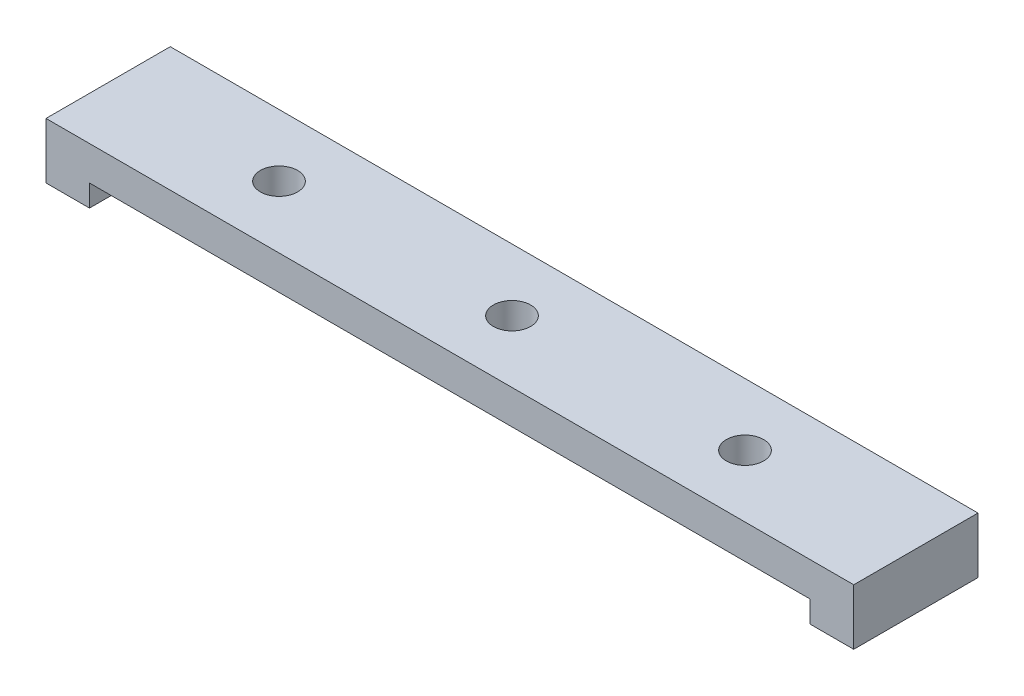
ISO-10303-21;
HEADER;
FILE_DESCRIPTION(('STEP AP214'),'2;1');
FILE_NAME('part.step','',(''),(''),'','','');
FILE_SCHEMA(('AUTOMOTIVE_DESIGN { 1 0 10303 214 1 1 1 1 }'));
ENDSEC;
DATA;
#1=APPLICATION_CONTEXT('core data for automotive mechanical design processes');
#2=APPLICATION_PROTOCOL_DEFINITION('international standard','automotive_design',2000,#1);
#3=PRODUCT_CONTEXT('',#1,'mechanical');
#4=PRODUCT('Part','Part','',(#3));
#5=PRODUCT_RELATED_PRODUCT_CATEGORY('part','',(#4));
#6=PRODUCT_DEFINITION_FORMATION('','',#4);
#7=PRODUCT_DEFINITION_CONTEXT('part definition',#1,'design');
#8=PRODUCT_DEFINITION('design','',#6,#7);
#9=PRODUCT_DEFINITION_SHAPE('','',#8);
#10=(LENGTH_UNIT() NAMED_UNIT(*) SI_UNIT(.MILLI.,.METRE.));
#11=(NAMED_UNIT(*) PLANE_ANGLE_UNIT() SI_UNIT($,.RADIAN.));
#12=(NAMED_UNIT(*) SI_UNIT($,.STERADIAN.) SOLID_ANGLE_UNIT());
#13=UNCERTAINTY_MEASURE_WITH_UNIT(LENGTH_MEASURE(1.E-05),#10,'distance_accuracy_value','');
#14=(GEOMETRIC_REPRESENTATION_CONTEXT(3) GLOBAL_UNCERTAINTY_ASSIGNED_CONTEXT((#13)) GLOBAL_UNIT_ASSIGNED_CONTEXT((#10,
#11,#12)) REPRESENTATION_CONTEXT('',''));
#15=CARTESIAN_POINT('',(0.,0.,0.));
#16=DIRECTION('',(0.,0.,1.));
#17=DIRECTION('',(1.,0.,0.));
#18=AXIS2_PLACEMENT_3D('',#15,#16,#17);
#19=CARTESIAN_POINT('',(0.,0.,0.));
#20=DIRECTION('',(0.,-1.,0.));
#21=DIRECTION('',(0.,0.,-1.));
#22=AXIS2_PLACEMENT_3D('',#19,#20,#21);
#23=PLANE('',#22);
#24=DIRECTION('',(0.,0.,-1.));
#25=VECTOR('',#24,1.);
#26=CARTESIAN_POINT('',(3.5,0.,0.));
#27=LINE('',#26,#25);
#28=CARTESIAN_POINT('',(3.5,0.,0.));
#29=VERTEX_POINT('',#28);
#30=CARTESIAN_POINT('',(3.5,0.,-10.));
#31=VERTEX_POINT('',#30);
#32=EDGE_CURVE('E109',#29,#31,#27,.T.);
#33=ORIENTED_EDGE('',*,*,#32,.F.);
#34=DIRECTION('',(1.,0.,0.));
#35=VECTOR('',#34,1.);
#36=CARTESIAN_POINT('',(0.,0.,0.));
#37=LINE('',#36,#35);
#38=CARTESIAN_POINT('',(0.,0.,0.));
#39=VERTEX_POINT('',#38);
#40=EDGE_CURVE('E132',#39,#29,#37,.T.);
#41=ORIENTED_EDGE('',*,*,#40,.F.);
#42=DIRECTION('',(0.,0.,1.));
#43=VECTOR('',#42,1.);
#44=CARTESIAN_POINT('',(0.,0.,0.));
#45=LINE('',#44,#43);
#46=CARTESIAN_POINT('',(0.,0.,-10.));
#47=VERTEX_POINT('',#46);
#48=EDGE_CURVE('E126',#47,#39,#45,.T.);
#49=ORIENTED_EDGE('',*,*,#48,.F.);
#50=DIRECTION('',(-1.,0.,0.));
#51=VECTOR('',#50,1.);
#52=CARTESIAN_POINT('',(0.,0.,-10.));
#53=LINE('',#52,#51);
#54=EDGE_CURVE('E82',#31,#47,#53,.T.);
#55=ORIENTED_EDGE('',*,*,#54,.F.);
#56=EDGE_LOOP('',(#33,#41,#49,#55));
#57=FACE_BOUND('',#56,.T.);
#58=ADVANCED_FACE('F37',(#57),#23,.T.);
#59=CARTESIAN_POINT('',(13.75,4.5,-5.));
#60=DIRECTION('',(0.,-1.,0.));
#61=DIRECTION('',(0.,0.,-1.));
#62=AXIS2_PLACEMENT_3D('',#59,#60,#61);
#63=CYLINDRICAL_SURFACE('',#62,1.5);
#64=CARTESIAN_POINT('',(13.75,4.5,-5.));
#65=DIRECTION('',(0.,1.,0.));
#66=DIRECTION('',(0.,0.,1.));
#67=AXIS2_PLACEMENT_3D('',#64,#65,#66);
#68=CIRCLE('',#67,1.5);
#69=CARTESIAN_POINT('',(13.75,4.5,-3.5));
#70=VERTEX_POINT('',#69);
#71=EDGE_CURVE('E159',#70,#70,#68,.T.);
#72=ORIENTED_EDGE('',*,*,#71,.T.);
#73=EDGE_LOOP('',(#72));
#74=FACE_BOUND('',#73,.T.);
#75=CARTESIAN_POINT('',(13.75,1.75,-5.));
#76=DIRECTION('',(0.,-1.,0.));
#77=DIRECTION('',(0.,0.,-1.));
#78=AXIS2_PLACEMENT_3D('',#75,#76,#77);
#79=CIRCLE('',#78,1.5);
#80=CARTESIAN_POINT('',(13.75,1.75,-6.5));
#81=VERTEX_POINT('',#80);
#82=EDGE_CURVE('E179',#81,#81,#79,.T.);
#83=ORIENTED_EDGE('',*,*,#82,.T.);
#84=EDGE_LOOP('',(#83));
#85=FACE_BOUND('',#84,.T.);
#86=ADVANCED_FACE('F201',(#74,#85),#63,.F.);
#87=CARTESIAN_POINT('',(32.5,4.5,-5.));
#88=DIRECTION('',(0.,-1.,0.));
#89=DIRECTION('',(0.,0.,-1.));
#90=AXIS2_PLACEMENT_3D('',#87,#88,#89);
#91=CYLINDRICAL_SURFACE('',#90,1.5);
#92=CARTESIAN_POINT('',(32.5,4.5,-5.));
#93=DIRECTION('',(0.,1.,0.));
#94=DIRECTION('',(0.,0.,1.));
#95=AXIS2_PLACEMENT_3D('',#92,#93,#94);
#96=CIRCLE('',#95,1.5);
#97=CARTESIAN_POINT('',(32.5,4.5,-3.5));
#98=VERTEX_POINT('',#97);
#99=EDGE_CURVE('E185',#98,#98,#96,.T.);
#100=ORIENTED_EDGE('',*,*,#99,.T.);
#101=EDGE_LOOP('',(#100));
#102=FACE_BOUND('',#101,.T.);
#103=CARTESIAN_POINT('',(32.5,1.75,-5.));
#104=DIRECTION('',(0.,-1.,0.));
#105=DIRECTION('',(0.,0.,-1.));
#106=AXIS2_PLACEMENT_3D('',#103,#104,#105);
#107=CIRCLE('',#106,1.5);
#108=CARTESIAN_POINT('',(32.5,1.75,-6.50000000000001));
#109=VERTEX_POINT('',#108);
#110=EDGE_CURVE('E176',#109,#109,#107,.T.);
#111=ORIENTED_EDGE('',*,*,#110,.T.);
#112=EDGE_LOOP('',(#111));
#113=FACE_BOUND('',#112,.T.);
#114=ADVANCED_FACE('F205',(#102,#113),#91,.F.);
#115=CARTESIAN_POINT('',(51.25,4.5,-5.));
#116=DIRECTION('',(0.,-1.,0.));
#117=DIRECTION('',(0.,0.,-1.));
#118=AXIS2_PLACEMENT_3D('',#115,#116,#117);
#119=CYLINDRICAL_SURFACE('',#118,1.5);
#120=CARTESIAN_POINT('',(51.25,4.5,-5.));
#121=DIRECTION('',(0.,1.,0.));
#122=DIRECTION('',(0.,0.,1.));
#123=AXIS2_PLACEMENT_3D('',#120,#121,#122);
#124=CIRCLE('',#123,1.5);
#125=CARTESIAN_POINT('',(51.25,4.5,-3.5));
#126=VERTEX_POINT('',#125);
#127=EDGE_CURVE('E182',#126,#126,#124,.T.);
#128=ORIENTED_EDGE('',*,*,#127,.T.);
#129=EDGE_LOOP('',(#128));
#130=FACE_BOUND('',#129,.T.);
#131=CARTESIAN_POINT('',(51.25,1.75,-5.));
#132=DIRECTION('',(0.,-1.,0.));
#133=DIRECTION('',(0.,0.,-1.));
#134=AXIS2_PLACEMENT_3D('',#131,#132,#133);
#135=CIRCLE('',#134,1.5);
#136=CARTESIAN_POINT('',(51.25,1.75,-6.50000000000001));
#137=VERTEX_POINT('',#136);
#138=EDGE_CURVE('E41',#137,#137,#135,.T.);
#139=ORIENTED_EDGE('',*,*,#138,.T.);
#140=EDGE_LOOP('',(#139));
#141=FACE_BOUND('',#140,.T.);
#142=ADVANCED_FACE('F265',(#130,#141),#119,.F.);
#143=CARTESIAN_POINT('',(0.,4.5,0.));
#144=DIRECTION('',(0.,-1.,0.));
#145=DIRECTION('',(0.,0.,-1.));
#146=AXIS2_PLACEMENT_3D('',#143,#144,#145);
#147=PLANE('',#146);
#148=ORIENTED_EDGE('',*,*,#99,.F.);
#149=EDGE_LOOP('',(#148));
#150=FACE_BOUND('',#149,.T.);
#151=DIRECTION('',(0.,0.,1.));
#152=VECTOR('',#151,1.);
#153=CARTESIAN_POINT('',(0.,4.5,0.));
#154=LINE('',#153,#152);
#155=CARTESIAN_POINT('',(0.,4.5,-10.));
#156=VERTEX_POINT('',#155);
#157=CARTESIAN_POINT('',(0.,4.5,0.));
#158=VERTEX_POINT('',#157);
#159=EDGE_CURVE('E131',#156,#158,#154,.T.);
#160=ORIENTED_EDGE('',*,*,#159,.T.);
#161=DIRECTION('',(1.,0.,0.));
#162=VECTOR('',#161,1.);
#163=CARTESIAN_POINT('',(0.,4.5,0.));
#164=LINE('',#163,#162);
#165=CARTESIAN_POINT('',(65.,4.5,0.));
#166=VERTEX_POINT('',#165);
#167=EDGE_CURVE('E89',#158,#166,#164,.T.);
#168=ORIENTED_EDGE('',*,*,#167,.T.);
#169=DIRECTION('',(0.,0.,-1.));
#170=VECTOR('',#169,1.);
#171=CARTESIAN_POINT('',(65.,4.5,0.));
#172=LINE('',#171,#170);
#173=CARTESIAN_POINT('',(65.,4.5,-10.));
#174=VERTEX_POINT('',#173);
#175=EDGE_CURVE('E147',#166,#174,#172,.T.);
#176=ORIENTED_EDGE('',*,*,#175,.T.);
#177=DIRECTION('',(-1.,0.,0.));
#178=VECTOR('',#177,1.);
#179=CARTESIAN_POINT('',(0.,4.5,-10.));
#180=LINE('',#179,#178);
#181=EDGE_CURVE('E62',#174,#156,#180,.T.);
#182=ORIENTED_EDGE('',*,*,#181,.T.);
#183=EDGE_LOOP('',(#160,#168,#176,#182));
#184=FACE_BOUND('',#183,.T.);
#185=ORIENTED_EDGE('',*,*,#71,.F.);
#186=EDGE_LOOP('',(#185));
#187=FACE_BOUND('',#186,.T.);
#188=ORIENTED_EDGE('',*,*,#127,.F.);
#189=EDGE_LOOP('',(#188));
#190=FACE_BOUND('',#189,.T.);
#191=ADVANCED_FACE('F190',(#150,#184,#187,#190),#147,.F.);
#192=DIRECTION('',(0.,0.,1.));
#193=VECTOR('',#192,1.);
#194=CARTESIAN_POINT('',(61.5,0.,0.));
#195=LINE('',#194,#193);
#196=CARTESIAN_POINT('',(61.5,0.,-10.));
#197=VERTEX_POINT('',#196);
#198=CARTESIAN_POINT('',(61.5,0.,0.));
#199=VERTEX_POINT('',#198);
#200=EDGE_CURVE('E115',#197,#199,#195,.T.);
#201=ORIENTED_EDGE('',*,*,#200,.F.);
#202=CARTESIAN_POINT('',(65.,0.,-10.));
#203=VERTEX_POINT('',#202);
#204=EDGE_CURVE('E127',#203,#197,#53,.T.);
#205=ORIENTED_EDGE('',*,*,#204,.F.);
#206=DIRECTION('',(0.,0.,-1.));
#207=VECTOR('',#206,1.);
#208=CARTESIAN_POINT('',(65.,0.,0.));
#209=LINE('',#208,#207);
#210=CARTESIAN_POINT('',(65.,0.,0.));
#211=VERTEX_POINT('',#210);
#212=EDGE_CURVE('E128',#211,#203,#209,.T.);
#213=ORIENTED_EDGE('',*,*,#212,.F.);
#214=EDGE_CURVE('E153',#199,#211,#37,.T.);
#215=ORIENTED_EDGE('',*,*,#214,.F.);
#216=EDGE_LOOP('',(#201,#205,#213,#215));
#217=FACE_BOUND('',#216,.T.);
#218=ADVANCED_FACE('F152',(#217),#23,.T.);
#219=CARTESIAN_POINT('',(0.,4.5,0.));
#220=DIRECTION('',(1.,0.,0.));
#221=DIRECTION('',(0.,0.,-1.));
#222=AXIS2_PLACEMENT_3D('',#219,#220,#221);
#223=PLANE('',#222);
#224=ORIENTED_EDGE('',*,*,#48,.T.);
#225=DIRECTION('',(0.,-1.,0.));
#226=VECTOR('',#225,1.);
#227=CARTESIAN_POINT('',(0.,4.5,0.));
#228=LINE('',#227,#226);
#229=EDGE_CURVE('E12',#158,#39,#228,.T.);
#230=ORIENTED_EDGE('',*,*,#229,.F.);
#231=ORIENTED_EDGE('',*,*,#159,.F.);
#232=DIRECTION('',(0.,-1.,0.));
#233=VECTOR('',#232,1.);
#234=CARTESIAN_POINT('',(0.,4.5,-10.));
#235=LINE('',#234,#233);
#236=EDGE_CURVE('E136',#156,#47,#235,.T.);
#237=ORIENTED_EDGE('',*,*,#236,.T.);
#238=EDGE_LOOP('',(#224,#230,#231,#237));
#239=FACE_BOUND('',#238,.T.);
#240=ADVANCED_FACE('F39',(#239),#223,.F.);
#241=CARTESIAN_POINT('',(0.,4.5,0.));
#242=DIRECTION('',(0.,0.,-1.));
#243=DIRECTION('',(-1.,0.,0.));
#244=AXIS2_PLACEMENT_3D('',#241,#242,#243);
#245=PLANE('',#244);
#246=ORIENTED_EDGE('',*,*,#40,.T.);
#247=DIRECTION('',(0.,-1.,0.));
#248=VECTOR('',#247,1.);
#249=CARTESIAN_POINT('',(3.5,63.3557558782486,0.));
#250=LINE('',#249,#248);
#251=CARTESIAN_POINT('',(3.5,1.75,0.));
#252=VERTEX_POINT('',#251);
#253=EDGE_CURVE('E112',#252,#29,#250,.T.);
#254=ORIENTED_EDGE('',*,*,#253,.F.);
#255=DIRECTION('',(1.,0.,0.));
#256=VECTOR('',#255,1.);
#257=CARTESIAN_POINT('',(3.5,1.75,0.));
#258=LINE('',#257,#256);
#259=CARTESIAN_POINT('',(61.5,1.75,0.));
#260=VERTEX_POINT('',#259);
#261=EDGE_CURVE('E166',#252,#260,#258,.T.);
#262=ORIENTED_EDGE('',*,*,#261,.T.);
#263=DIRECTION('',(0.,-1.,0.));
#264=VECTOR('',#263,1.);
#265=CARTESIAN_POINT('',(61.5,63.3557558782486,0.));
#266=LINE('',#265,#264);
#267=EDGE_CURVE('E164',#260,#199,#266,.T.);
#268=ORIENTED_EDGE('',*,*,#267,.T.);
#269=ORIENTED_EDGE('',*,*,#214,.T.);
#270=DIRECTION('',(0.,-1.,0.));
#271=VECTOR('',#270,1.);
#272=CARTESIAN_POINT('',(65.,4.5,0.));
#273=LINE('',#272,#271);
#274=EDGE_CURVE('E46',#166,#211,#273,.T.);
#275=ORIENTED_EDGE('',*,*,#274,.F.);
#276=ORIENTED_EDGE('',*,*,#167,.F.);
#277=ORIENTED_EDGE('',*,*,#229,.T.);
#278=EDGE_LOOP('',(#246,#254,#262,#268,#269,#275,#276,#277));
#279=FACE_BOUND('',#278,.T.);
#280=ADVANCED_FACE('F161',(#279),#245,.F.);
#281=CARTESIAN_POINT('',(65.,4.5,0.));
#282=DIRECTION('',(-1.,0.,0.));
#283=DIRECTION('',(0.,0.,1.));
#284=AXIS2_PLACEMENT_3D('',#281,#282,#283);
#285=PLANE('',#284);
#286=ORIENTED_EDGE('',*,*,#212,.T.);
#287=DIRECTION('',(0.,-1.,0.));
#288=VECTOR('',#287,1.);
#289=CARTESIAN_POINT('',(65.,4.5,-10.));
#290=LINE('',#289,#288);
#291=EDGE_CURVE('E138',#174,#203,#290,.T.);
#292=ORIENTED_EDGE('',*,*,#291,.F.);
#293=ORIENTED_EDGE('',*,*,#175,.F.);
#294=ORIENTED_EDGE('',*,*,#274,.T.);
#295=EDGE_LOOP('',(#286,#292,#293,#294));
#296=FACE_BOUND('',#295,.T.);
#297=ADVANCED_FACE('F145',(#296),#285,.F.);
#298=CARTESIAN_POINT('',(0.,4.5,-10.));
#299=DIRECTION('',(0.,0.,1.));
#300=DIRECTION('',(1.,0.,0.));
#301=AXIS2_PLACEMENT_3D('',#298,#299,#300);
#302=PLANE('',#301);
#303=DIRECTION('',(-1.,0.,0.));
#304=VECTOR('',#303,1.);
#305=CARTESIAN_POINT('',(3.5,1.75,-10.));
#306=LINE('',#305,#304);
#307=CARTESIAN_POINT('',(61.5,1.75,-10.));
#308=VERTEX_POINT('',#307);
#309=CARTESIAN_POINT('',(3.5,1.75,-10.));
#310=VERTEX_POINT('',#309);
#311=EDGE_CURVE('E121',#308,#310,#306,.T.);
#312=ORIENTED_EDGE('',*,*,#311,.T.);
#313=DIRECTION('',(0.,-1.,0.));
#314=VECTOR('',#313,1.);
#315=CARTESIAN_POINT('',(3.5,63.3557558782486,-10.));
#316=LINE('',#315,#314);
#317=EDGE_CURVE('E53',#310,#31,#316,.T.);
#318=ORIENTED_EDGE('',*,*,#317,.T.);
#319=ORIENTED_EDGE('',*,*,#54,.T.);
#320=ORIENTED_EDGE('',*,*,#236,.F.);
#321=ORIENTED_EDGE('',*,*,#181,.F.);
#322=ORIENTED_EDGE('',*,*,#291,.T.);
#323=ORIENTED_EDGE('',*,*,#204,.T.);
#324=DIRECTION('',(0.,-1.,0.));
#325=VECTOR('',#324,1.);
#326=CARTESIAN_POINT('',(61.5,63.3557558782486,-10.));
#327=LINE('',#326,#325);
#328=EDGE_CURVE('E122',#308,#197,#327,.T.);
#329=ORIENTED_EDGE('',*,*,#328,.F.);
#330=EDGE_LOOP('',(#312,#318,#319,#320,#321,#322,#323,#329));
#331=FACE_BOUND('',#330,.T.);
#332=ADVANCED_FACE('F118',(#331),#302,.F.);
#333=CARTESIAN_POINT('',(3.5,63.3557558782486,0.));
#334=DIRECTION('',(-1.,0.,0.));
#335=DIRECTION('',(0.,0.,1.));
#336=AXIS2_PLACEMENT_3D('',#333,#334,#335);
#337=PLANE('',#336);
#338=DIRECTION('',(0.,0.,1.));
#339=VECTOR('',#338,1.);
#340=CARTESIAN_POINT('',(3.5,1.75,0.));
#341=LINE('',#340,#339);
#342=EDGE_CURVE('E175',#310,#252,#341,.T.);
#343=ORIENTED_EDGE('',*,*,#342,.T.);
#344=ORIENTED_EDGE('',*,*,#253,.T.);
#345=ORIENTED_EDGE('',*,*,#32,.T.);
#346=ORIENTED_EDGE('',*,*,#317,.F.);
#347=EDGE_LOOP('',(#343,#344,#345,#346));
#348=FACE_BOUND('',#347,.T.);
#349=ADVANCED_FACE('F110',(#348),#337,.F.);
#350=CARTESIAN_POINT('',(61.5,63.3557558782486,0.));
#351=DIRECTION('',(1.,0.,0.));
#352=DIRECTION('',(0.,0.,-1.));
#353=AXIS2_PLACEMENT_3D('',#350,#351,#352);
#354=PLANE('',#353);
#355=DIRECTION('',(0.,0.,-1.));
#356=VECTOR('',#355,1.);
#357=CARTESIAN_POINT('',(61.5,1.75,0.));
#358=LINE('',#357,#356);
#359=EDGE_CURVE('E169',#260,#308,#358,.T.);
#360=ORIENTED_EDGE('',*,*,#359,.T.);
#361=ORIENTED_EDGE('',*,*,#328,.T.);
#362=ORIENTED_EDGE('',*,*,#200,.T.);
#363=ORIENTED_EDGE('',*,*,#267,.F.);
#364=EDGE_LOOP('',(#360,#361,#362,#363));
#365=FACE_BOUND('',#364,.T.);
#366=ADVANCED_FACE('F227',(#365),#354,.F.);
#367=CARTESIAN_POINT('',(0.,1.75,0.));
#368=DIRECTION('',(0.,-1.,0.));
#369=DIRECTION('',(0.,0.,-1.));
#370=AXIS2_PLACEMENT_3D('',#367,#368,#369);
#371=PLANE('',#370);
#372=ORIENTED_EDGE('',*,*,#82,.F.);
#373=EDGE_LOOP('',(#372));
#374=FACE_BOUND('',#373,.T.);
#375=ORIENTED_EDGE('',*,*,#110,.F.);
#376=EDGE_LOOP('',(#375));
#377=FACE_BOUND('',#376,.T.);
#378=ORIENTED_EDGE('',*,*,#138,.F.);
#379=EDGE_LOOP('',(#378));
#380=FACE_BOUND('',#379,.T.);
#381=ORIENTED_EDGE('',*,*,#342,.F.);
#382=ORIENTED_EDGE('',*,*,#311,.F.);
#383=ORIENTED_EDGE('',*,*,#359,.F.);
#384=ORIENTED_EDGE('',*,*,#261,.F.);
#385=EDGE_LOOP('',(#381,#382,#383,#384));
#386=FACE_BOUND('',#385,.T.);
#387=ADVANCED_FACE('F234',(#374,#377,#380,#386),#371,.T.);
#388=CLOSED_SHELL('',(#58,#86,#114,#142,#191,#218,#240,#280,#297,#332,#349,#366,#387));
#389=MANIFOLD_SOLID_BREP('B2',#388);
#390=ADVANCED_BREP_SHAPE_REPRESENTATION('',(#18,#389),#14);
#391=SHAPE_DEFINITION_REPRESENTATION(#9,#390);
ENDSEC;
END-ISO-10303-21;
